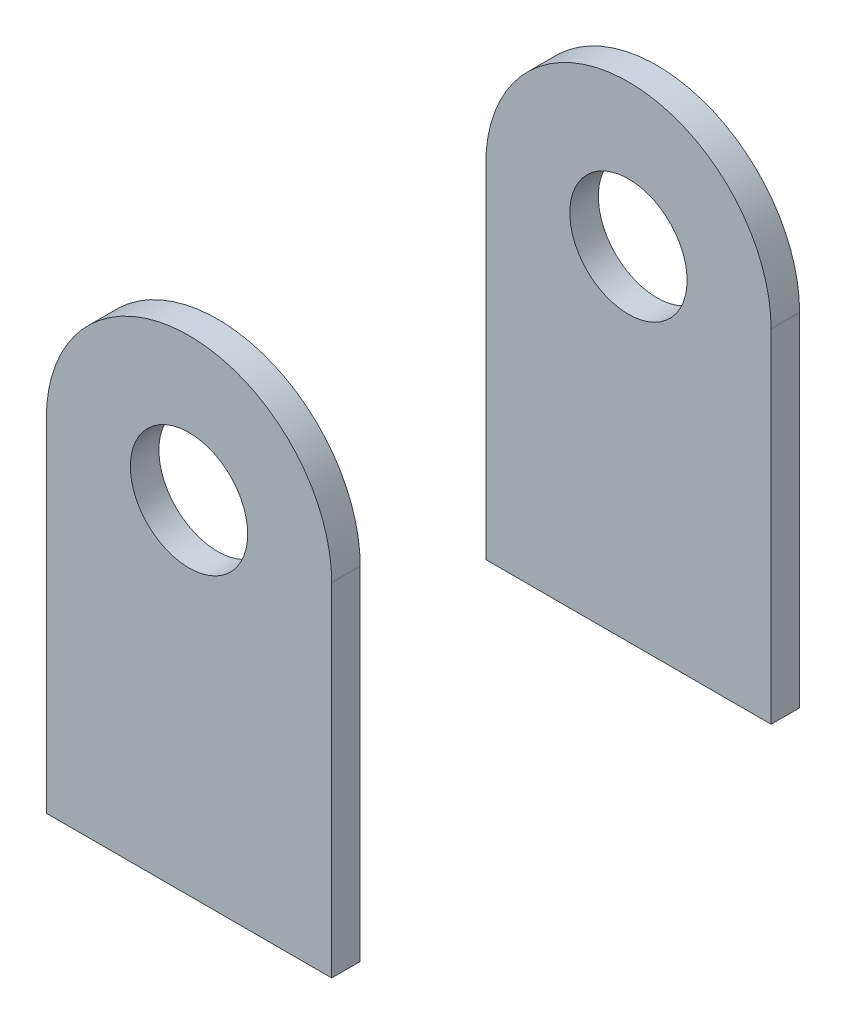
ISO-10303-21;
HEADER;
FILE_DESCRIPTION(('STEP AP214'),'2;1');
FILE_NAME('part.step','',(''),(''),'','','');
FILE_SCHEMA(('AUTOMOTIVE_DESIGN { 1 0 10303 214 1 1 1 1 }'));
ENDSEC;
DATA;
#1=APPLICATION_CONTEXT('core data for automotive mechanical design processes');
#2=APPLICATION_PROTOCOL_DEFINITION('international standard','automotive_design',2000,#1);
#3=PRODUCT_CONTEXT('',#1,'mechanical');
#4=PRODUCT('Part','Part','',(#3));
#5=PRODUCT_RELATED_PRODUCT_CATEGORY('part','',(#4));
#6=PRODUCT_DEFINITION_FORMATION('','',#4);
#7=PRODUCT_DEFINITION_CONTEXT('part definition',#1,'design');
#8=PRODUCT_DEFINITION('design','',#6,#7);
#9=PRODUCT_DEFINITION_SHAPE('','',#8);
#10=(LENGTH_UNIT() NAMED_UNIT(*) SI_UNIT(.MILLI.,.METRE.));
#11=(NAMED_UNIT(*) PLANE_ANGLE_UNIT() SI_UNIT($,.RADIAN.));
#12=(NAMED_UNIT(*) SI_UNIT($,.STERADIAN.) SOLID_ANGLE_UNIT());
#13=UNCERTAINTY_MEASURE_WITH_UNIT(LENGTH_MEASURE(1.E-05),#10,'distance_accuracy_value','');
#14=(GEOMETRIC_REPRESENTATION_CONTEXT(3) GLOBAL_UNCERTAINTY_ASSIGNED_CONTEXT((#13)) GLOBAL_UNIT_ASSIGNED_CONTEXT((#10,
#11,#12)) REPRESENTATION_CONTEXT('',''));
#15=CARTESIAN_POINT('',(0.,0.,0.));
#16=DIRECTION('',(0.,0.,1.));
#17=DIRECTION('',(1.,0.,0.));
#18=AXIS2_PLACEMENT_3D('',#15,#16,#17);
#19=CARTESIAN_POINT('',(0.,-19.05,-13.0175));
#20=DIRECTION('',(0.,1.,0.));
#21=DIRECTION('',(0.,0.,1.));
#22=AXIS2_PLACEMENT_3D('',#19,#20,#21);
#23=PLANE('',#22);
#24=DIRECTION('',(-1.,0.,0.));
#25=VECTOR('',#24,1.);
#26=CARTESIAN_POINT('',(0.,-19.05,-11.43));
#27=LINE('',#26,#25);
#28=CARTESIAN_POINT('',(7.9375,-19.05,-11.43));
#29=VERTEX_POINT('',#28);
#30=CARTESIAN_POINT('',(-7.9375,-19.05,-11.43));
#31=VERTEX_POINT('',#30);
#32=EDGE_CURVE('E119',#29,#31,#27,.T.);
#33=ORIENTED_EDGE('',*,*,#32,.T.);
#34=DIRECTION('',(0.,0.,1.));
#35=VECTOR('',#34,1.);
#36=CARTESIAN_POINT('',(-7.9375,-19.05,-13.0175));
#37=LINE('',#36,#35);
#38=CARTESIAN_POINT('',(-7.9375,-19.05,-13.0175));
#39=VERTEX_POINT('',#38);
#40=EDGE_CURVE('E12',#39,#31,#37,.T.);
#41=ORIENTED_EDGE('',*,*,#40,.F.);
#42=DIRECTION('',(-1.,0.,0.));
#43=VECTOR('',#42,1.);
#44=CARTESIAN_POINT('',(0.,-19.05,-13.0175));
#45=LINE('',#44,#43);
#46=CARTESIAN_POINT('',(7.9375,-19.05,-13.0175));
#47=VERTEX_POINT('',#46);
#48=EDGE_CURVE('E108',#47,#39,#45,.T.);
#49=ORIENTED_EDGE('',*,*,#48,.F.);
#50=DIRECTION('',(0.,0.,1.));
#51=VECTOR('',#50,1.);
#52=CARTESIAN_POINT('',(7.9375,-19.05,-13.0175));
#53=LINE('',#52,#51);
#54=EDGE_CURVE('E54',#47,#29,#53,.T.);
#55=ORIENTED_EDGE('',*,*,#54,.T.);
#56=EDGE_LOOP('',(#33,#41,#49,#55));
#57=FACE_BOUND('',#56,.T.);
#58=ADVANCED_FACE('F51',(#57),#23,.F.);
#59=CARTESIAN_POINT('',(-7.9375,0.,-13.0175));
#60=DIRECTION('',(1.,0.,0.));
#61=DIRECTION('',(0.,1.,0.));
#62=AXIS2_PLACEMENT_3D('',#59,#60,#61);
#63=PLANE('',#62);
#64=DIRECTION('',(0.,1.,0.));
#65=VECTOR('',#64,1.);
#66=CARTESIAN_POINT('',(-7.9375,0.,-11.43));
#67=LINE('',#66,#65);
#68=CARTESIAN_POINT('',(-7.9375,0.,-11.43));
#69=VERTEX_POINT('',#68);
#70=EDGE_CURVE('E90',#31,#69,#67,.T.);
#71=ORIENTED_EDGE('',*,*,#70,.T.);
#72=DIRECTION('',(0.,0.,1.));
#73=VECTOR('',#72,1.);
#74=CARTESIAN_POINT('',(-7.9375,0.,-13.0175));
#75=LINE('',#74,#73);
#76=CARTESIAN_POINT('',(-7.9375,0.,-13.0175));
#77=VERTEX_POINT('',#76);
#78=EDGE_CURVE('E60',#77,#69,#75,.T.);
#79=ORIENTED_EDGE('',*,*,#78,.F.);
#80=DIRECTION('',(0.,1.,0.));
#81=VECTOR('',#80,1.);
#82=CARTESIAN_POINT('',(-7.9375,0.,-13.0175));
#83=LINE('',#82,#81);
#84=EDGE_CURVE('E68',#39,#77,#83,.T.);
#85=ORIENTED_EDGE('',*,*,#84,.F.);
#86=ORIENTED_EDGE('',*,*,#40,.T.);
#87=EDGE_LOOP('',(#71,#79,#85,#86));
#88=FACE_BOUND('',#87,.T.);
#89=ADVANCED_FACE('F133',(#88),#63,.F.);
#90=CARTESIAN_POINT('',(0.,0.,-13.0175));
#91=DIRECTION('',(0.,0.,1.));
#92=DIRECTION('',(1.,0.,0.));
#93=AXIS2_PLACEMENT_3D('',#90,#91,#92);
#94=CYLINDRICAL_SURFACE('',#93,7.9375);
#95=CARTESIAN_POINT('',(0.,0.,-11.43));
#96=DIRECTION('',(0.,0.,1.));
#97=DIRECTION('',(1.,0.,0.));
#98=AXIS2_PLACEMENT_3D('',#95,#96,#97);
#99=CIRCLE('',#98,7.9375);
#100=CARTESIAN_POINT('',(7.9375,0.,-11.43));
#101=VERTEX_POINT('',#100);
#102=EDGE_CURVE('E102',#101,#69,#99,.T.);
#103=ORIENTED_EDGE('',*,*,#102,.F.);
#104=DIRECTION('',(0.,0.,1.));
#105=VECTOR('',#104,1.);
#106=CARTESIAN_POINT('',(7.9375,0.,-13.0175));
#107=LINE('',#106,#105);
#108=CARTESIAN_POINT('',(7.9375,0.,-13.0175));
#109=VERTEX_POINT('',#108);
#110=EDGE_CURVE('E99',#109,#101,#107,.T.);
#111=ORIENTED_EDGE('',*,*,#110,.F.);
#112=CARTESIAN_POINT('',(0.,0.,-13.0175));
#113=DIRECTION('',(0.,0.,1.));
#114=DIRECTION('',(1.,0.,0.));
#115=AXIS2_PLACEMENT_3D('',#112,#113,#114);
#116=CIRCLE('',#115,7.9375);
#117=EDGE_CURVE('E101',#109,#77,#116,.T.);
#118=ORIENTED_EDGE('',*,*,#117,.T.);
#119=ORIENTED_EDGE('',*,*,#78,.T.);
#120=EDGE_LOOP('',(#103,#111,#118,#119));
#121=FACE_BOUND('',#120,.T.);
#122=ADVANCED_FACE('F100',(#121),#94,.T.);
#123=CARTESIAN_POINT('',(7.9375,0.,-13.0175));
#124=DIRECTION('',(-1.,0.,0.));
#125=DIRECTION('',(0.,-1.,0.));
#126=AXIS2_PLACEMENT_3D('',#123,#124,#125);
#127=PLANE('',#126);
#128=DIRECTION('',(0.,-1.,0.));
#129=VECTOR('',#128,1.);
#130=CARTESIAN_POINT('',(7.9375,0.,-11.43));
#131=LINE('',#130,#129);
#132=EDGE_CURVE('E122',#101,#29,#131,.T.);
#133=ORIENTED_EDGE('',*,*,#132,.T.);
#134=ORIENTED_EDGE('',*,*,#54,.F.);
#135=DIRECTION('',(0.,-1.,0.));
#136=VECTOR('',#135,1.);
#137=CARTESIAN_POINT('',(7.9375,0.,-13.0175));
#138=LINE('',#137,#136);
#139=EDGE_CURVE('E96',#109,#47,#138,.T.);
#140=ORIENTED_EDGE('',*,*,#139,.F.);
#141=ORIENTED_EDGE('',*,*,#110,.T.);
#142=EDGE_LOOP('',(#133,#134,#140,#141));
#143=FACE_BOUND('',#142,.T.);
#144=ADVANCED_FACE('F105',(#143),#127,.F.);
#145=CARTESIAN_POINT('',(0.,0.,-13.0175));
#146=DIRECTION('',(0.,0.,1.));
#147=DIRECTION('',(1.,0.,0.));
#148=AXIS2_PLACEMENT_3D('',#145,#146,#147);
#149=CYLINDRICAL_SURFACE('',#148,3.2639);
#150=CARTESIAN_POINT('',(0.,0.,-13.0175));
#151=DIRECTION('',(0.,0.,1.));
#152=DIRECTION('',(1.,0.,0.));
#153=AXIS2_PLACEMENT_3D('',#150,#151,#152);
#154=CIRCLE('',#153,3.2639);
#155=CARTESIAN_POINT('',(3.2639,0.,-13.0175));
#156=VERTEX_POINT('',#155);
#157=EDGE_CURVE('E113',#156,#156,#154,.T.);
#158=ORIENTED_EDGE('',*,*,#157,.F.);
#159=EDGE_LOOP('',(#158));
#160=FACE_BOUND('',#159,.T.);
#161=CARTESIAN_POINT('',(0.,0.,-11.43));
#162=DIRECTION('',(0.,0.,1.));
#163=DIRECTION('',(1.,0.,0.));
#164=AXIS2_PLACEMENT_3D('',#161,#162,#163);
#165=CIRCLE('',#164,3.2639);
#166=CARTESIAN_POINT('',(3.2639,0.,-11.43));
#167=VERTEX_POINT('',#166);
#168=EDGE_CURVE('E126',#167,#167,#165,.T.);
#169=ORIENTED_EDGE('',*,*,#168,.T.);
#170=EDGE_LOOP('',(#169));
#171=FACE_BOUND('',#170,.T.);
#172=ADVANCED_FACE('F141',(#160,#171),#149,.F.);
#173=CARTESIAN_POINT('',(0.,0.,-13.0175));
#174=DIRECTION('',(0.,0.,1.));
#175=DIRECTION('',(1.,0.,0.));
#176=AXIS2_PLACEMENT_3D('',#173,#174,#175);
#177=PLANE('',#176);
#178=ORIENTED_EDGE('',*,*,#48,.T.);
#179=ORIENTED_EDGE('',*,*,#84,.T.);
#180=ORIENTED_EDGE('',*,*,#117,.F.);
#181=ORIENTED_EDGE('',*,*,#139,.T.);
#182=EDGE_LOOP('',(#178,#179,#180,#181));
#183=FACE_BOUND('',#182,.T.);
#184=ORIENTED_EDGE('',*,*,#157,.T.);
#185=EDGE_LOOP('',(#184));
#186=FACE_BOUND('',#185,.T.);
#187=ADVANCED_FACE('F110',(#183,#186),#177,.F.);
#188=CARTESIAN_POINT('',(0.,0.,-11.43));
#189=DIRECTION('',(0.,0.,1.));
#190=DIRECTION('',(1.,0.,0.));
#191=AXIS2_PLACEMENT_3D('',#188,#189,#190);
#192=PLANE('',#191);
#193=ORIENTED_EDGE('',*,*,#32,.F.);
#194=ORIENTED_EDGE('',*,*,#132,.F.);
#195=ORIENTED_EDGE('',*,*,#102,.T.);
#196=ORIENTED_EDGE('',*,*,#70,.F.);
#197=EDGE_LOOP('',(#193,#194,#195,#196));
#198=FACE_BOUND('',#197,.T.);
#199=ORIENTED_EDGE('',*,*,#168,.F.);
#200=EDGE_LOOP('',(#199));
#201=FACE_BOUND('',#200,.T.);
#202=ADVANCED_FACE('F134',(#198,#201),#192,.T.);
#203=CLOSED_SHELL('',(#58,#89,#122,#144,#172,#187,#202));
#204=MANIFOLD_SOLID_BREP('B2',#203);
#205=CARTESIAN_POINT('',(0.,-19.05,13.0175));
#206=DIRECTION('',(0.,-1.,0.));
#207=DIRECTION('',(0.,0.,-1.));
#208=AXIS2_PLACEMENT_3D('',#205,#206,#207);
#209=PLANE('',#208);
#210=DIRECTION('',(-1.,0.,0.));
#211=VECTOR('',#210,1.);
#212=CARTESIAN_POINT('',(0.,-19.05,11.43));
#213=LINE('',#212,#211);
#214=CARTESIAN_POINT('',(7.9375,-19.05,11.43));
#215=VERTEX_POINT('',#214);
#216=CARTESIAN_POINT('',(-7.9375,-19.05,11.43));
#217=VERTEX_POINT('',#216);
#218=EDGE_CURVE('E276',#215,#217,#213,.T.);
#219=ORIENTED_EDGE('',*,*,#218,.F.);
#220=DIRECTION('',(0.,0.,-1.));
#221=VECTOR('',#220,1.);
#222=CARTESIAN_POINT('',(7.9375,-19.05,13.0175));
#223=LINE('',#222,#221);
#224=CARTESIAN_POINT('',(7.9375,-19.05,13.0175));
#225=VERTEX_POINT('',#224);
#226=EDGE_CURVE('E49',#225,#215,#223,.T.);
#227=ORIENTED_EDGE('',*,*,#226,.F.);
#228=DIRECTION('',(-1.,0.,0.));
#229=VECTOR('',#228,1.);
#230=CARTESIAN_POINT('',(0.,-19.05,13.0175));
#231=LINE('',#230,#229);
#232=CARTESIAN_POINT('',(-7.9375,-19.05,13.0175));
#233=VERTEX_POINT('',#232);
#234=EDGE_CURVE('E267',#225,#233,#231,.T.);
#235=ORIENTED_EDGE('',*,*,#234,.T.);
#236=DIRECTION('',(0.,0.,-1.));
#237=VECTOR('',#236,1.);
#238=CARTESIAN_POINT('',(-7.9375,-19.05,13.0175));
#239=LINE('',#238,#237);
#240=EDGE_CURVE('E224',#233,#217,#239,.T.);
#241=ORIENTED_EDGE('',*,*,#240,.T.);
#242=EDGE_LOOP('',(#219,#227,#235,#241));
#243=FACE_BOUND('',#242,.T.);
#244=ADVANCED_FACE('F208',(#243),#209,.T.);
#245=CARTESIAN_POINT('',(7.9375,0.,13.0175));
#246=DIRECTION('',(1.,0.,0.));
#247=DIRECTION('',(0.,1.,0.));
#248=AXIS2_PLACEMENT_3D('',#245,#246,#247);
#249=PLANE('',#248);
#250=DIRECTION('',(0.,-1.,0.));
#251=VECTOR('',#250,1.);
#252=CARTESIAN_POINT('',(7.9375,0.,11.43));
#253=LINE('',#252,#251);
#254=CARTESIAN_POINT('',(7.9375,0.,11.43));
#255=VERTEX_POINT('',#254);
#256=EDGE_CURVE('E256',#255,#215,#253,.T.);
#257=ORIENTED_EDGE('',*,*,#256,.F.);
#258=DIRECTION('',(0.,0.,-1.));
#259=VECTOR('',#258,1.);
#260=CARTESIAN_POINT('',(7.9375,0.,13.0175));
#261=LINE('',#260,#259);
#262=CARTESIAN_POINT('',(7.9375,0.,13.0175));
#263=VERTEX_POINT('',#262);
#264=EDGE_CURVE('E216',#263,#255,#261,.T.);
#265=ORIENTED_EDGE('',*,*,#264,.F.);
#266=DIRECTION('',(0.,-1.,0.));
#267=VECTOR('',#266,1.);
#268=CARTESIAN_POINT('',(7.9375,0.,13.0175));
#269=LINE('',#268,#267);
#270=EDGE_CURVE('E254',#263,#225,#269,.T.);
#271=ORIENTED_EDGE('',*,*,#270,.T.);
#272=ORIENTED_EDGE('',*,*,#226,.T.);
#273=EDGE_LOOP('',(#257,#265,#271,#272));
#274=FACE_BOUND('',#273,.T.);
#275=ADVANCED_FACE('F252',(#274),#249,.T.);
#276=CARTESIAN_POINT('',(0.,0.,13.0175));
#277=DIRECTION('',(0.,0.,-1.));
#278=DIRECTION('',(-1.,0.,0.));
#279=AXIS2_PLACEMENT_3D('',#276,#277,#278);
#280=CYLINDRICAL_SURFACE('',#279,7.9375);
#281=CARTESIAN_POINT('',(0.,0.,11.43));
#282=DIRECTION('',(0.,0.,1.));
#283=DIRECTION('',(1.,0.,0.));
#284=AXIS2_PLACEMENT_3D('',#281,#282,#283);
#285=CIRCLE('',#284,7.9375);
#286=CARTESIAN_POINT('',(-7.9375,0.,11.43));
#287=VERTEX_POINT('',#286);
#288=EDGE_CURVE('E279',#255,#287,#285,.T.);
#289=ORIENTED_EDGE('',*,*,#288,.T.);
#290=DIRECTION('',(0.,0.,-1.));
#291=VECTOR('',#290,1.);
#292=CARTESIAN_POINT('',(-7.9375,0.,13.0175));
#293=LINE('',#292,#291);
#294=CARTESIAN_POINT('',(-7.9375,0.,13.0175));
#295=VERTEX_POINT('',#294);
#296=EDGE_CURVE('E238',#295,#287,#293,.T.);
#297=ORIENTED_EDGE('',*,*,#296,.F.);
#298=CARTESIAN_POINT('',(0.,0.,13.0175));
#299=DIRECTION('',(0.,0.,1.));
#300=DIRECTION('',(1.,0.,0.));
#301=AXIS2_PLACEMENT_3D('',#298,#299,#300);
#302=CIRCLE('',#301,7.9375);
#303=EDGE_CURVE('E259',#263,#295,#302,.T.);
#304=ORIENTED_EDGE('',*,*,#303,.F.);
#305=ORIENTED_EDGE('',*,*,#264,.T.);
#306=EDGE_LOOP('',(#289,#297,#304,#305));
#307=FACE_BOUND('',#306,.T.);
#308=ADVANCED_FACE('F260',(#307),#280,.T.);
#309=CARTESIAN_POINT('',(-7.9375,0.,13.0175));
#310=DIRECTION('',(-1.,0.,0.));
#311=DIRECTION('',(0.,-1.,0.));
#312=AXIS2_PLACEMENT_3D('',#309,#310,#311);
#313=PLANE('',#312);
#314=DIRECTION('',(0.,1.,0.));
#315=VECTOR('',#314,1.);
#316=CARTESIAN_POINT('',(-7.9375,0.,11.43));
#317=LINE('',#316,#315);
#318=EDGE_CURVE('E281',#217,#287,#317,.T.);
#319=ORIENTED_EDGE('',*,*,#318,.F.);
#320=ORIENTED_EDGE('',*,*,#240,.F.);
#321=DIRECTION('',(0.,1.,0.));
#322=VECTOR('',#321,1.);
#323=CARTESIAN_POINT('',(-7.9375,0.,13.0175));
#324=LINE('',#323,#322);
#325=EDGE_CURVE('E263',#233,#295,#324,.T.);
#326=ORIENTED_EDGE('',*,*,#325,.T.);
#327=ORIENTED_EDGE('',*,*,#296,.T.);
#328=EDGE_LOOP('',(#319,#320,#326,#327));
#329=FACE_BOUND('',#328,.T.);
#330=ADVANCED_FACE('F293',(#329),#313,.T.);
#331=CARTESIAN_POINT('',(0.,0.,13.0175));
#332=DIRECTION('',(0.,0.,-1.));
#333=DIRECTION('',(-1.,0.,0.));
#334=AXIS2_PLACEMENT_3D('',#331,#332,#333);
#335=CYLINDRICAL_SURFACE('',#334,3.2639);
#336=CARTESIAN_POINT('',(0.,0.,13.0175));
#337=DIRECTION('',(0.,0.,1.));
#338=DIRECTION('',(1.,0.,0.));
#339=AXIS2_PLACEMENT_3D('',#336,#337,#338);
#340=CIRCLE('',#339,3.2639);
#341=CARTESIAN_POINT('',(3.2639,0.,13.0175));
#342=VERTEX_POINT('',#341);
#343=EDGE_CURVE('E273',#342,#342,#340,.T.);
#344=ORIENTED_EDGE('',*,*,#343,.T.);
#345=EDGE_LOOP('',(#344));
#346=FACE_BOUND('',#345,.T.);
#347=CARTESIAN_POINT('',(0.,0.,11.43));
#348=DIRECTION('',(0.,0.,1.));
#349=DIRECTION('',(1.,0.,0.));
#350=AXIS2_PLACEMENT_3D('',#347,#348,#349);
#351=CIRCLE('',#350,3.2639);
#352=CARTESIAN_POINT('',(3.2639,0.,11.43));
#353=VERTEX_POINT('',#352);
#354=EDGE_CURVE('E269',#353,#353,#351,.T.);
#355=ORIENTED_EDGE('',*,*,#354,.F.);
#356=EDGE_LOOP('',(#355));
#357=FACE_BOUND('',#356,.T.);
#358=ADVANCED_FACE('F291',(#346,#357),#335,.F.);
#359=CARTESIAN_POINT('',(0.,0.,13.0175));
#360=DIRECTION('',(0.,0.,1.));
#361=DIRECTION('',(1.,0.,0.));
#362=AXIS2_PLACEMENT_3D('',#359,#360,#361);
#363=PLANE('',#362);
#364=ORIENTED_EDGE('',*,*,#234,.F.);
#365=ORIENTED_EDGE('',*,*,#270,.F.);
#366=ORIENTED_EDGE('',*,*,#303,.T.);
#367=ORIENTED_EDGE('',*,*,#325,.F.);
#368=EDGE_LOOP('',(#364,#365,#366,#367));
#369=FACE_BOUND('',#368,.T.);
#370=ORIENTED_EDGE('',*,*,#343,.F.);
#371=EDGE_LOOP('',(#370));
#372=FACE_BOUND('',#371,.T.);
#373=ADVANCED_FACE('F265',(#369,#372),#363,.T.);
#374=CARTESIAN_POINT('',(0.,0.,11.43));
#375=DIRECTION('',(0.,0.,1.));
#376=DIRECTION('',(1.,0.,0.));
#377=AXIS2_PLACEMENT_3D('',#374,#375,#376);
#378=PLANE('',#377);
#379=ORIENTED_EDGE('',*,*,#218,.T.);
#380=ORIENTED_EDGE('',*,*,#318,.T.);
#381=ORIENTED_EDGE('',*,*,#288,.F.);
#382=ORIENTED_EDGE('',*,*,#256,.T.);
#383=EDGE_LOOP('',(#379,#380,#381,#382));
#384=FACE_BOUND('',#383,.T.);
#385=ORIENTED_EDGE('',*,*,#354,.T.);
#386=EDGE_LOOP('',(#385));
#387=FACE_BOUND('',#386,.T.);
#388=ADVANCED_FACE('F289',(#384,#387),#378,.F.);
#389=CLOSED_SHELL('',(#244,#275,#308,#330,#358,#373,#388));
#390=MANIFOLD_SOLID_BREP('B6',#389);
#391=ADVANCED_BREP_SHAPE_REPRESENTATION('',(#18,#204,#390),#14);
#392=SHAPE_DEFINITION_REPRESENTATION(#9,#391);
ENDSEC;
END-ISO-10303-21;
